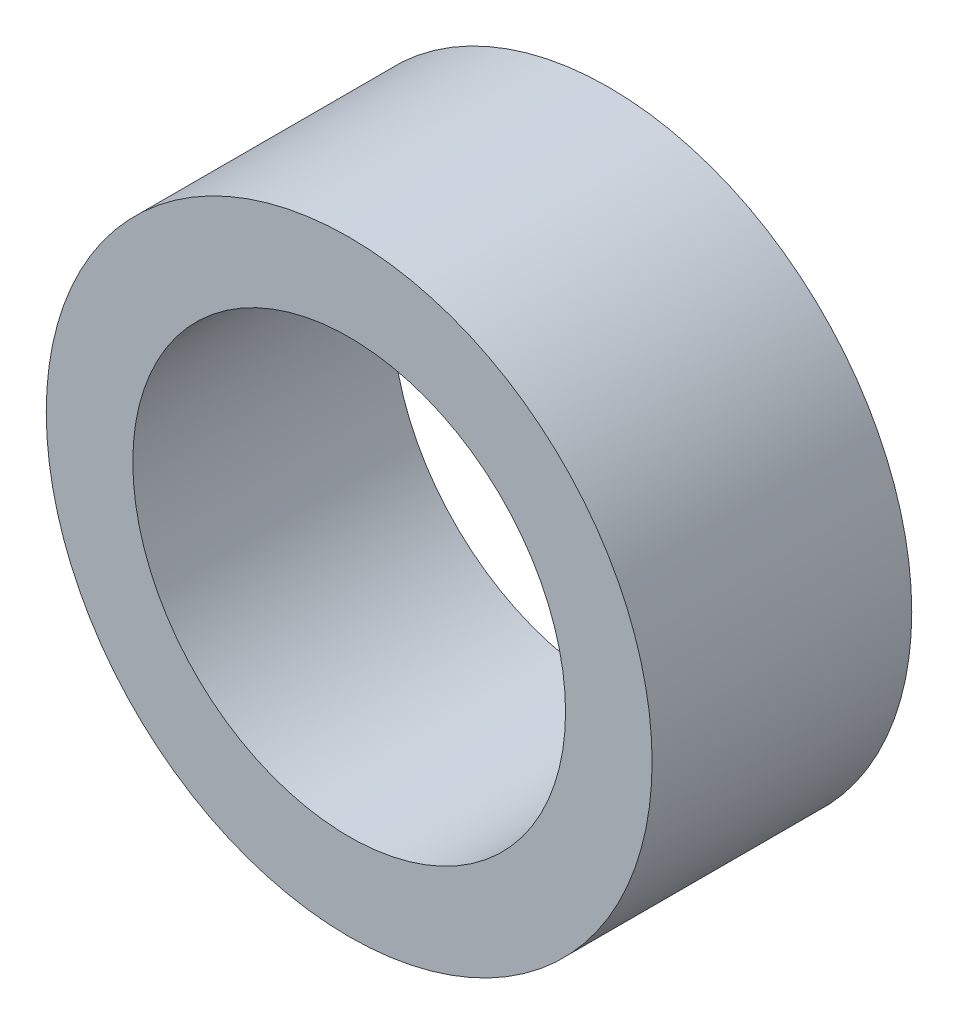
ISO-10303-21;
HEADER;
FILE_DESCRIPTION(('STEP AP214'),'2;1');
FILE_NAME('part.step','',(''),(''),'','','');
FILE_SCHEMA(('AUTOMOTIVE_DESIGN { 1 0 10303 214 1 1 1 1 }'));
ENDSEC;
DATA;
#1=APPLICATION_CONTEXT('core data for automotive mechanical design processes');
#2=APPLICATION_PROTOCOL_DEFINITION('international standard','automotive_design',2000,#1);
#3=PRODUCT_CONTEXT('',#1,'mechanical');
#4=PRODUCT('Part','Part','',(#3));
#5=PRODUCT_RELATED_PRODUCT_CATEGORY('part','',(#4));
#6=PRODUCT_DEFINITION_FORMATION('','',#4);
#7=PRODUCT_DEFINITION_CONTEXT('part definition',#1,'design');
#8=PRODUCT_DEFINITION('design','',#6,#7);
#9=PRODUCT_DEFINITION_SHAPE('','',#8);
#10=(LENGTH_UNIT() NAMED_UNIT(*) SI_UNIT(.MILLI.,.METRE.));
#11=(NAMED_UNIT(*) PLANE_ANGLE_UNIT() SI_UNIT($,.RADIAN.));
#12=(NAMED_UNIT(*) SI_UNIT($,.STERADIAN.) SOLID_ANGLE_UNIT());
#13=UNCERTAINTY_MEASURE_WITH_UNIT(LENGTH_MEASURE(1.E-05),#10,'distance_accuracy_value','');
#14=(GEOMETRIC_REPRESENTATION_CONTEXT(3) GLOBAL_UNCERTAINTY_ASSIGNED_CONTEXT((#13)) GLOBAL_UNIT_ASSIGNED_CONTEXT((#10,
#11,#12)) REPRESENTATION_CONTEXT('',''));
#15=CARTESIAN_POINT('',(0.,0.,0.));
#16=DIRECTION('',(0.,0.,1.));
#17=DIRECTION('',(1.,0.,0.));
#18=AXIS2_PLACEMENT_3D('',#15,#16,#17);
#19=CARTESIAN_POINT('',(0.,0.,3.));
#20=DIRECTION('',(0.,0.,1.));
#21=DIRECTION('',(1.,0.,0.));
#22=AXIS2_PLACEMENT_3D('',#19,#20,#21);
#23=PLANE('',#22);
#24=CARTESIAN_POINT('',(0.,0.,3.));
#25=DIRECTION('',(0.,0.,1.));
#26=DIRECTION('',(1.,0.,0.));
#27=AXIS2_PLACEMENT_3D('',#24,#25,#26);
#28=CIRCLE('',#27,3.5);
#29=CARTESIAN_POINT('',(3.5,0.,3.));
#30=VERTEX_POINT('',#29);
#31=EDGE_CURVE('E10',#30,#30,#28,.T.);
#32=ORIENTED_EDGE('',*,*,#31,.T.);
#33=EDGE_LOOP('',(#32));
#34=FACE_BOUND('',#33,.T.);
#35=CARTESIAN_POINT('',(0.,0.,3.));
#36=DIRECTION('',(0.,0.,1.));
#37=DIRECTION('',(1.,0.,0.));
#38=AXIS2_PLACEMENT_3D('',#35,#36,#37);
#39=CIRCLE('',#38,2.5);
#40=CARTESIAN_POINT('',(2.5,0.,3.));
#41=VERTEX_POINT('',#40);
#42=EDGE_CURVE('E53',#41,#41,#39,.T.);
#43=ORIENTED_EDGE('',*,*,#42,.F.);
#44=EDGE_LOOP('',(#43));
#45=FACE_BOUND('',#44,.T.);
#46=ADVANCED_FACE('F40',(#34,#45),#23,.T.);
#47=CARTESIAN_POINT('',(0.,0.,0.));
#48=DIRECTION('',(0.,0.,1.));
#49=DIRECTION('',(1.,0.,0.));
#50=AXIS2_PLACEMENT_3D('',#47,#48,#49);
#51=PLANE('',#50);
#52=CARTESIAN_POINT('',(0.,0.,0.));
#53=DIRECTION('',(0.,0.,1.));
#54=DIRECTION('',(1.,0.,0.));
#55=AXIS2_PLACEMENT_3D('',#52,#53,#54);
#56=CIRCLE('',#55,3.5);
#57=CARTESIAN_POINT('',(3.5,0.,0.));
#58=VERTEX_POINT('',#57);
#59=EDGE_CURVE('E44',#58,#58,#56,.T.);
#60=ORIENTED_EDGE('',*,*,#59,.F.);
#61=EDGE_LOOP('',(#60));
#62=FACE_BOUND('',#61,.T.);
#63=CARTESIAN_POINT('',(0.,0.,0.));
#64=DIRECTION('',(0.,0.,1.));
#65=DIRECTION('',(1.,0.,0.));
#66=AXIS2_PLACEMENT_3D('',#63,#64,#65);
#67=CIRCLE('',#66,2.5);
#68=CARTESIAN_POINT('',(2.5,0.,0.));
#69=VERTEX_POINT('',#68);
#70=EDGE_CURVE('E55',#69,#69,#67,.T.);
#71=ORIENTED_EDGE('',*,*,#70,.T.);
#72=EDGE_LOOP('',(#71));
#73=FACE_BOUND('',#72,.T.);
#74=ADVANCED_FACE('F67',(#62,#73),#51,.F.);
#75=CARTESIAN_POINT('',(0.,0.,3.));
#76=DIRECTION('',(0.,0.,-1.));
#77=DIRECTION('',(-1.,0.,0.));
#78=AXIS2_PLACEMENT_3D('',#75,#76,#77);
#79=CYLINDRICAL_SURFACE('',#78,3.5);
#80=ORIENTED_EDGE('',*,*,#31,.F.);
#81=EDGE_LOOP('',(#80));
#82=FACE_BOUND('',#81,.T.);
#83=ORIENTED_EDGE('',*,*,#59,.T.);
#84=EDGE_LOOP('',(#83));
#85=FACE_BOUND('',#84,.T.);
#86=ADVANCED_FACE('F42',(#82,#85),#79,.T.);
#87=CARTESIAN_POINT('',(0.,0.,3.));
#88=DIRECTION('',(0.,0.,-1.));
#89=DIRECTION('',(-1.,0.,0.));
#90=AXIS2_PLACEMENT_3D('',#87,#88,#89);
#91=CYLINDRICAL_SURFACE('',#90,2.5);
#92=ORIENTED_EDGE('',*,*,#42,.T.);
#93=EDGE_LOOP('',(#92));
#94=FACE_BOUND('',#93,.T.);
#95=ORIENTED_EDGE('',*,*,#70,.F.);
#96=EDGE_LOOP('',(#95));
#97=FACE_BOUND('',#96,.T.);
#98=ADVANCED_FACE('F63',(#94,#97),#91,.F.);
#99=CLOSED_SHELL('',(#46,#74,#86,#98));
#100=MANIFOLD_SOLID_BREP('B2',#99);
#101=ADVANCED_BREP_SHAPE_REPRESENTATION('',(#18,#100),#14);
#102=SHAPE_DEFINITION_REPRESENTATION(#9,#101);
ENDSEC;
END-ISO-10303-21;
